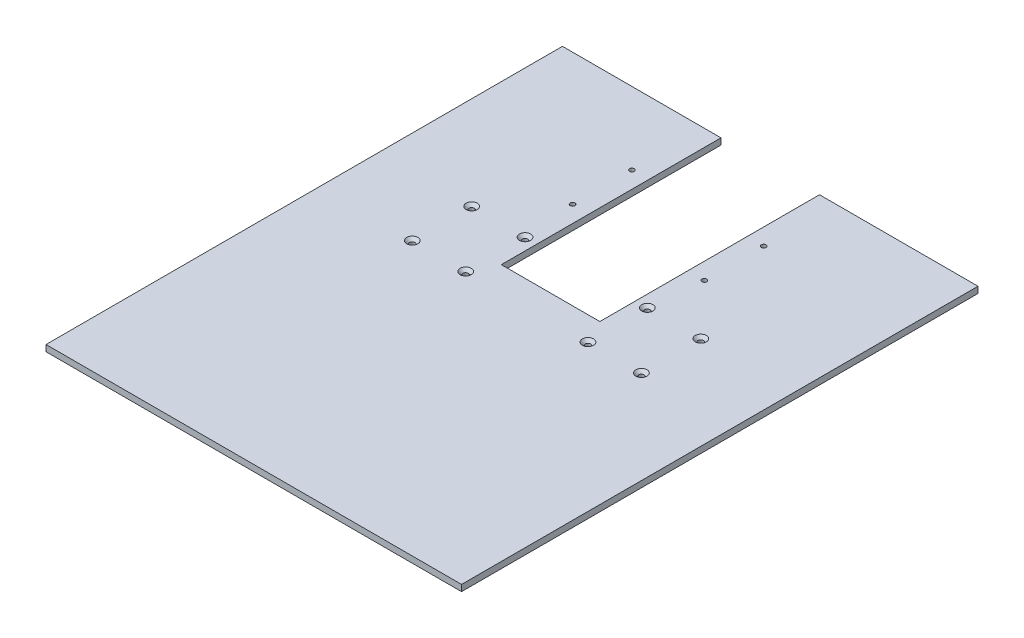
ISO-10303-21;
HEADER;
FILE_DESCRIPTION(('STEP AP214'),'2;1');
FILE_NAME('part.step','',(''),(''),'','','');
FILE_SCHEMA(('AUTOMOTIVE_DESIGN { 1 0 10303 214 1 1 1 1 }'));
ENDSEC;
DATA;
#1=APPLICATION_CONTEXT('core data for automotive mechanical design processes');
#2=APPLICATION_PROTOCOL_DEFINITION('international standard','automotive_design',2000,#1);
#3=PRODUCT_CONTEXT('',#1,'mechanical');
#4=PRODUCT('Part','Part','',(#3));
#5=PRODUCT_RELATED_PRODUCT_CATEGORY('part','',(#4));
#6=PRODUCT_DEFINITION_FORMATION('','',#4);
#7=PRODUCT_DEFINITION_CONTEXT('part definition',#1,'design');
#8=PRODUCT_DEFINITION('design','',#6,#7);
#9=PRODUCT_DEFINITION_SHAPE('','',#8);
#10=(LENGTH_UNIT() NAMED_UNIT(*) SI_UNIT(.MILLI.,.METRE.));
#11=(NAMED_UNIT(*) PLANE_ANGLE_UNIT() SI_UNIT($,.RADIAN.));
#12=(NAMED_UNIT(*) SI_UNIT($,.STERADIAN.) SOLID_ANGLE_UNIT());
#13=UNCERTAINTY_MEASURE_WITH_UNIT(LENGTH_MEASURE(1.E-05),#10,'distance_accuracy_value','');
#14=(GEOMETRIC_REPRESENTATION_CONTEXT(3) GLOBAL_UNCERTAINTY_ASSIGNED_CONTEXT((#13)) GLOBAL_UNIT_ASSIGNED_CONTEXT((#10,
#11,#12)) REPRESENTATION_CONTEXT('',''));
#15=CARTESIAN_POINT('',(0.,0.,0.));
#16=DIRECTION('',(0.,0.,1.));
#17=DIRECTION('',(1.,0.,0.));
#18=AXIS2_PLACEMENT_3D('',#15,#16,#17);
#19=CARTESIAN_POINT('',(0.,5.3,0.));
#20=DIRECTION('',(0.,-1.,0.));
#21=DIRECTION('',(0.,0.,-1.));
#22=AXIS2_PLACEMENT_3D('',#19,#20,#21);
#23=PLANE('',#22);
#24=CARTESIAN_POINT('',(-181.830578512397,5.3,47.4793388429752));
#25=DIRECTION('',(0.,1.,0.));
#26=DIRECTION('',(0.,0.,1.));
#27=AXIS2_PLACEMENT_3D('',#24,#25,#26);
#28=CIRCLE('',#27,4.70000000000001);
#29=CARTESIAN_POINT('',(-181.830578512397,5.3,52.1793388429752));
#30=VERTEX_POINT('',#29);
#31=EDGE_CURVE('E542',#30,#30,#28,.T.);
#32=ORIENTED_EDGE('',*,*,#31,.F.);
#33=EDGE_LOOP('',(#32));
#34=FACE_BOUND('',#33,.T.);
#35=DIRECTION('',(0.,0.,1.));
#36=VECTOR('',#35,1.);
#37=CARTESIAN_POINT('',(-260.330578512397,5.3,327.479338842975));
#38=LINE('',#37,#36);
#39=CARTESIAN_POINT('',(-260.330578512397,5.3,-107.520661157025));
#40=VERTEX_POINT('',#39);
#41=CARTESIAN_POINT('',(-260.330578512397,5.3,327.479338842975));
#42=VERTEX_POINT('',#41);
#43=EDGE_CURVE('E109',#40,#42,#38,.T.);
#44=ORIENTED_EDGE('',*,*,#43,.T.);
#45=DIRECTION('',(1.,0.,0.));
#46=VECTOR('',#45,1.);
#47=CARTESIAN_POINT('',(-260.330578512397,5.3,327.479338842975));
#48=LINE('',#47,#46);
#49=CARTESIAN_POINT('',(89.6694214876034,5.3,327.479338842975));
#50=VERTEX_POINT('',#49);
#51=EDGE_CURVE('E156',#42,#50,#48,.T.);
#52=ORIENTED_EDGE('',*,*,#51,.T.);
#53=DIRECTION('',(0.,0.,-1.));
#54=VECTOR('',#53,1.);
#55=CARTESIAN_POINT('',(89.6694214876034,5.3,327.479338842975));
#56=LINE('',#55,#54);
#57=CARTESIAN_POINT('',(89.6694214876034,5.3,-107.520661157025));
#58=VERTEX_POINT('',#57);
#59=EDGE_CURVE('E158',#50,#58,#56,.T.);
#60=ORIENTED_EDGE('',*,*,#59,.T.);
#61=DIRECTION('',(1.,0.,0.));
#62=VECTOR('',#61,1.);
#63=CARTESIAN_POINT('',(-43.8305785123966,5.30000000000001,-107.520661157025));
#64=LINE('',#63,#62);
#65=CARTESIAN_POINT('',(-43.8305785123966,5.30000000000001,-107.520661157025));
#66=VERTEX_POINT('',#65);
#67=EDGE_CURVE('E133',#66,#58,#64,.T.);
#68=ORIENTED_EDGE('',*,*,#67,.F.);
#69=DIRECTION('',(0.,0.,1.));
#70=VECTOR('',#69,1.);
#71=CARTESIAN_POINT('',(-43.8305785123966,5.30000000000001,-107.520661157025));
#72=LINE('',#71,#70);
#73=CARTESIAN_POINT('',(-43.8305785123966,5.3,77.4793388429752));
#74=VERTEX_POINT('',#73);
#75=EDGE_CURVE('E123',#66,#74,#72,.T.);
#76=ORIENTED_EDGE('',*,*,#75,.T.);
#77=DIRECTION('',(-1.,0.,0.));
#78=VECTOR('',#77,1.);
#79=CARTESIAN_POINT('',(-260.330578512397,5.3,77.4793388429752));
#80=LINE('',#79,#78);
#81=CARTESIAN_POINT('',(-126.830578512397,5.3,77.4793388429752));
#82=VERTEX_POINT('',#81);
#83=EDGE_CURVE('E51',#74,#82,#80,.T.);
#84=ORIENTED_EDGE('',*,*,#83,.T.);
#85=DIRECTION('',(0.,0.,1.));
#86=VECTOR('',#85,1.);
#87=CARTESIAN_POINT('',(-126.830578512397,5.30000000000001,-107.520661157025));
#88=LINE('',#87,#86);
#89=CARTESIAN_POINT('',(-126.830578512397,5.30000000000001,-107.520661157025));
#90=VERTEX_POINT('',#89);
#91=EDGE_CURVE('E148',#90,#82,#88,.T.);
#92=ORIENTED_EDGE('',*,*,#91,.F.);
#93=DIRECTION('',(1.,0.,0.));
#94=VECTOR('',#93,1.);
#95=CARTESIAN_POINT('',(-126.830578512397,5.30000000000001,-107.520661157025));
#96=LINE('',#95,#94);
#97=EDGE_CURVE('E146',#40,#90,#96,.T.);
#98=ORIENTED_EDGE('',*,*,#97,.F.);
#99=EDGE_LOOP('',(#44,#52,#60,#68,#76,#84,#92,#98));
#100=FACE_BOUND('',#99,.T.);
#101=CARTESIAN_POINT('',(-140.830578512397,5.3,3.47933884297523));
#102=DIRECTION('',(0.,1.,0.));
#103=DIRECTION('',(0.,0.,1.));
#104=AXIS2_PLACEMENT_3D('',#101,#102,#103);
#105=CIRCLE('',#104,2.);
#106=CARTESIAN_POINT('',(-140.830578512397,5.3,5.47933884297523));
#107=VERTEX_POINT('',#106);
#108=EDGE_CURVE('E630',#107,#107,#105,.T.);
#109=ORIENTED_EDGE('',*,*,#108,.F.);
#110=EDGE_LOOP('',(#109));
#111=FACE_BOUND('',#110,.T.);
#112=CARTESIAN_POINT('',(-140.830578512397,5.3,-46.5206611570248));
#113=DIRECTION('',(0.,1.,0.));
#114=DIRECTION('',(0.,0.,1.));
#115=AXIS2_PLACEMENT_3D('',#112,#113,#114);
#116=CIRCLE('',#115,2.);
#117=CARTESIAN_POINT('',(-140.830578512397,5.3,-44.5206611570248));
#118=VERTEX_POINT('',#117);
#119=EDGE_CURVE('E624',#118,#118,#116,.T.);
#120=ORIENTED_EDGE('',*,*,#119,.F.);
#121=EDGE_LOOP('',(#120));
#122=FACE_BOUND('',#121,.T.);
#123=CARTESIAN_POINT('',(-29.8305785123966,5.3,-46.5206611570248));
#124=DIRECTION('',(0.,1.,0.));
#125=DIRECTION('',(0.,0.,1.));
#126=AXIS2_PLACEMENT_3D('',#123,#124,#125);
#127=CIRCLE('',#126,2.);
#128=CARTESIAN_POINT('',(-29.8305785123966,5.3,-44.5206611570248));
#129=VERTEX_POINT('',#128);
#130=EDGE_CURVE('E618',#129,#129,#127,.T.);
#131=ORIENTED_EDGE('',*,*,#130,.F.);
#132=EDGE_LOOP('',(#131));
#133=FACE_BOUND('',#132,.T.);
#134=CARTESIAN_POINT('',(-29.8305785123966,5.3,3.47933884297523));
#135=DIRECTION('',(0.,1.,0.));
#136=DIRECTION('',(0.,0.,1.));
#137=AXIS2_PLACEMENT_3D('',#134,#135,#136);
#138=CIRCLE('',#137,2.);
#139=CARTESIAN_POINT('',(-29.8305785123966,5.3,5.47933884297523));
#140=VERTEX_POINT('',#139);
#141=EDGE_CURVE('E612',#140,#140,#138,.T.);
#142=ORIENTED_EDGE('',*,*,#141,.F.);
#143=EDGE_LOOP('',(#142));
#144=FACE_BOUND('',#143,.T.);
#145=CARTESIAN_POINT('',(-33.8305785123966,5.3,97.4793388429752));
#146=DIRECTION('',(0.,1.,0.));
#147=DIRECTION('',(0.,0.,1.));
#148=AXIS2_PLACEMENT_3D('',#145,#146,#147);
#149=CIRCLE('',#148,4.7);
#150=CARTESIAN_POINT('',(-33.8305785123966,5.3,102.179338842975));
#151=VERTEX_POINT('',#150);
#152=EDGE_CURVE('E603',#151,#151,#149,.T.);
#153=ORIENTED_EDGE('',*,*,#152,.F.);
#154=EDGE_LOOP('',(#153));
#155=FACE_BOUND('',#154,.T.);
#156=CARTESIAN_POINT('',(11.1694214876034,5.3,97.4793388429752));
#157=DIRECTION('',(0.,1.,0.));
#158=DIRECTION('',(0.,0.,1.));
#159=AXIS2_PLACEMENT_3D('',#156,#157,#158);
#160=CIRCLE('',#159,4.7);
#161=CARTESIAN_POINT('',(11.1694214876034,5.3,102.179338842975));
#162=VERTEX_POINT('',#161);
#163=EDGE_CURVE('E594',#162,#162,#160,.T.);
#164=ORIENTED_EDGE('',*,*,#163,.F.);
#165=EDGE_LOOP('',(#164));
#166=FACE_BOUND('',#165,.T.);
#167=CARTESIAN_POINT('',(11.1694214876034,5.3,47.4793388429752));
#168=DIRECTION('',(0.,1.,0.));
#169=DIRECTION('',(0.,0.,1.));
#170=AXIS2_PLACEMENT_3D('',#167,#168,#169);
#171=CIRCLE('',#170,4.7);
#172=CARTESIAN_POINT('',(11.1694214876034,5.3,52.1793388429752));
#173=VERTEX_POINT('',#172);
#174=EDGE_CURVE('E585',#173,#173,#171,.T.);
#175=ORIENTED_EDGE('',*,*,#174,.F.);
#176=EDGE_LOOP('',(#175));
#177=FACE_BOUND('',#176,.T.);
#178=CARTESIAN_POINT('',(-33.8305785123966,5.3,47.4793388429752));
#179=DIRECTION('',(0.,1.,0.));
#180=DIRECTION('',(0.,0.,1.));
#181=AXIS2_PLACEMENT_3D('',#178,#179,#180);
#182=CIRCLE('',#181,4.7);
#183=CARTESIAN_POINT('',(-33.8305785123966,5.3,52.1793388429752));
#184=VERTEX_POINT('',#183);
#185=EDGE_CURVE('E576',#184,#184,#182,.T.);
#186=ORIENTED_EDGE('',*,*,#185,.F.);
#187=EDGE_LOOP('',(#186));
#188=FACE_BOUND('',#187,.T.);
#189=CARTESIAN_POINT('',(-136.830578512397,5.3,97.4793388429752));
#190=DIRECTION('',(0.,1.,0.));
#191=DIRECTION('',(0.,0.,1.));
#192=AXIS2_PLACEMENT_3D('',#189,#190,#191);
#193=CIRCLE('',#192,4.70000000000001);
#194=CARTESIAN_POINT('',(-136.830578512397,5.3,102.179338842975));
#195=VERTEX_POINT('',#194);
#196=EDGE_CURVE('E567',#195,#195,#193,.T.);
#197=ORIENTED_EDGE('',*,*,#196,.F.);
#198=EDGE_LOOP('',(#197));
#199=FACE_BOUND('',#198,.T.);
#200=CARTESIAN_POINT('',(-181.830578512397,5.3,97.4793388429752));
#201=DIRECTION('',(0.,1.,0.));
#202=DIRECTION('',(0.,0.,1.));
#203=AXIS2_PLACEMENT_3D('',#200,#201,#202);
#204=CIRCLE('',#203,4.70000000000001);
#205=CARTESIAN_POINT('',(-181.830578512397,5.3,102.179338842975));
#206=VERTEX_POINT('',#205);
#207=EDGE_CURVE('E558',#206,#206,#204,.T.);
#208=ORIENTED_EDGE('',*,*,#207,.F.);
#209=EDGE_LOOP('',(#208));
#210=FACE_BOUND('',#209,.T.);
#211=CARTESIAN_POINT('',(-136.830578512397,5.3,47.4793388429752));
#212=DIRECTION('',(0.,1.,0.));
#213=DIRECTION('',(0.,0.,1.));
#214=AXIS2_PLACEMENT_3D('',#211,#212,#213);
#215=CIRCLE('',#214,4.70000000000001);
#216=CARTESIAN_POINT('',(-136.830578512397,5.3,52.1793388429752));
#217=VERTEX_POINT('',#216);
#218=EDGE_CURVE('E549',#217,#217,#215,.T.);
#219=ORIENTED_EDGE('',*,*,#218,.F.);
#220=EDGE_LOOP('',(#219));
#221=FACE_BOUND('',#220,.T.);
#222=ADVANCED_FACE('F36',(#34,#100,#111,#122,#133,#144,#155,#166,#177,#188,#199,#210,#221),#23,.F.);
#223=CARTESIAN_POINT('',(-260.330578512397,5.3,77.4793388429752));
#224=DIRECTION('',(0.,0.,1.));
#225=DIRECTION('',(1.,0.,0.));
#226=AXIS2_PLACEMENT_3D('',#223,#224,#225);
#227=PLANE('',#226);
#228=DIRECTION('',(0.,1.,0.));
#229=VECTOR('',#228,1.);
#230=CARTESIAN_POINT('',(-43.8305785123966,5.30000000000001,77.4793388429752));
#231=LINE('',#230,#229);
#232=CARTESIAN_POINT('',(-43.8305785123966,0.,77.4793388429752));
#233=VERTEX_POINT('',#232);
#234=EDGE_CURVE('E113',#233,#74,#231,.T.);
#235=ORIENTED_EDGE('',*,*,#234,.F.);
#236=DIRECTION('',(-1.,0.,0.));
#237=VECTOR('',#236,1.);
#238=CARTESIAN_POINT('',(-260.330578512397,0.,77.4793388429752));
#239=LINE('',#238,#237);
#240=CARTESIAN_POINT('',(-126.830578512397,0.,77.4793388429752));
#241=VERTEX_POINT('',#240);
#242=EDGE_CURVE('E100',#233,#241,#239,.T.);
#243=ORIENTED_EDGE('',*,*,#242,.T.);
#244=DIRECTION('',(0.,-1.,0.));
#245=VECTOR('',#244,1.);
#246=CARTESIAN_POINT('',(-126.830578512397,5.30000000000001,77.4793388429752));
#247=LINE('',#246,#245);
#248=EDGE_CURVE('E117',#82,#241,#247,.T.);
#249=ORIENTED_EDGE('',*,*,#248,.F.);
#250=ORIENTED_EDGE('',*,*,#83,.F.);
#251=EDGE_LOOP('',(#235,#243,#249,#250));
#252=FACE_BOUND('',#251,.T.);
#253=ADVANCED_FACE('F114',(#252),#227,.F.);
#254=CARTESIAN_POINT('',(-260.330578512397,5.3,327.479338842975));
#255=DIRECTION('',(1.,0.,0.));
#256=DIRECTION('',(0.,0.,-1.));
#257=AXIS2_PLACEMENT_3D('',#254,#255,#256);
#258=PLANE('',#257);
#259=DIRECTION('',(0.,0.,1.));
#260=VECTOR('',#259,1.);
#261=CARTESIAN_POINT('',(-260.330578512397,0.,327.479338842975));
#262=LINE('',#261,#260);
#263=CARTESIAN_POINT('',(-260.330578512397,0.,-107.520661157025));
#264=VERTEX_POINT('',#263);
#265=CARTESIAN_POINT('',(-260.330578512397,0.,327.479338842975));
#266=VERTEX_POINT('',#265);
#267=EDGE_CURVE('E153',#264,#266,#262,.T.);
#268=ORIENTED_EDGE('',*,*,#267,.T.);
#269=DIRECTION('',(0.,-1.,0.));
#270=VECTOR('',#269,1.);
#271=CARTESIAN_POINT('',(-260.330578512397,5.3,327.479338842975));
#272=LINE('',#271,#270);
#273=EDGE_CURVE('E11',#42,#266,#272,.T.);
#274=ORIENTED_EDGE('',*,*,#273,.F.);
#275=ORIENTED_EDGE('',*,*,#43,.F.);
#276=DIRECTION('',(0.,1.,0.));
#277=VECTOR('',#276,1.);
#278=CARTESIAN_POINT('',(-260.330578512397,5.3,-107.520661157025));
#279=LINE('',#278,#277);
#280=EDGE_CURVE('E143',#264,#40,#279,.T.);
#281=ORIENTED_EDGE('',*,*,#280,.F.);
#282=EDGE_LOOP('',(#268,#274,#275,#281));
#283=FACE_BOUND('',#282,.T.);
#284=ADVANCED_FACE('F38',(#283),#258,.F.);
#285=CARTESIAN_POINT('',(-260.330578512397,5.3,327.479338842975));
#286=DIRECTION('',(0.,0.,-1.));
#287=DIRECTION('',(-1.,0.,0.));
#288=AXIS2_PLACEMENT_3D('',#285,#286,#287);
#289=PLANE('',#288);
#290=DIRECTION('',(1.,0.,0.));
#291=VECTOR('',#290,1.);
#292=CARTESIAN_POINT('',(-260.330578512397,0.,327.479338842975));
#293=LINE('',#292,#291);
#294=CARTESIAN_POINT('',(89.6694214876034,0.,327.479338842975));
#295=VERTEX_POINT('',#294);
#296=EDGE_CURVE('E163',#266,#295,#293,.T.);
#297=ORIENTED_EDGE('',*,*,#296,.T.);
#298=DIRECTION('',(0.,-1.,0.));
#299=VECTOR('',#298,1.);
#300=CARTESIAN_POINT('',(89.6694214876034,5.3,327.479338842975));
#301=LINE('',#300,#299);
#302=EDGE_CURVE('E44',#50,#295,#301,.T.);
#303=ORIENTED_EDGE('',*,*,#302,.F.);
#304=ORIENTED_EDGE('',*,*,#51,.F.);
#305=ORIENTED_EDGE('',*,*,#273,.T.);
#306=EDGE_LOOP('',(#297,#303,#304,#305));
#307=FACE_BOUND('',#306,.T.);
#308=ADVANCED_FACE('F178',(#307),#289,.F.);
#309=CARTESIAN_POINT('',(89.6694214876034,5.3,327.479338842975));
#310=DIRECTION('',(-1.,0.,0.));
#311=DIRECTION('',(0.,0.,1.));
#312=AXIS2_PLACEMENT_3D('',#309,#310,#311);
#313=PLANE('',#312);
#314=DIRECTION('',(0.,0.,-1.));
#315=VECTOR('',#314,1.);
#316=CARTESIAN_POINT('',(89.6694214876034,0.,327.479338842975));
#317=LINE('',#316,#315);
#318=CARTESIAN_POINT('',(89.6694214876034,0.,-107.520661157025));
#319=VERTEX_POINT('',#318);
#320=EDGE_CURVE('E110',#295,#319,#317,.T.);
#321=ORIENTED_EDGE('',*,*,#320,.T.);
#322=DIRECTION('',(0.,-1.,0.));
#323=VECTOR('',#322,1.);
#324=CARTESIAN_POINT('',(89.6694214876034,5.3,-107.520661157025));
#325=LINE('',#324,#323);
#326=EDGE_CURVE('E125',#58,#319,#325,.T.);
#327=ORIENTED_EDGE('',*,*,#326,.F.);
#328=ORIENTED_EDGE('',*,*,#59,.F.);
#329=ORIENTED_EDGE('',*,*,#302,.T.);
#330=EDGE_LOOP('',(#321,#327,#328,#329));
#331=FACE_BOUND('',#330,.T.);
#332=ADVANCED_FACE('F170',(#331),#313,.F.);
#333=CARTESIAN_POINT('',(0.,0.,0.));
#334=DIRECTION('',(0.,-1.,0.));
#335=DIRECTION('',(0.,0.,-1.));
#336=AXIS2_PLACEMENT_3D('',#333,#334,#335);
#337=PLANE('',#336);
#338=CARTESIAN_POINT('',(-181.830578512397,0.,47.4793388429752));
#339=DIRECTION('',(0.,1.,0.));
#340=DIRECTION('',(0.,0.,1.));
#341=AXIS2_PLACEMENT_3D('',#338,#339,#340);
#342=CIRCLE('',#341,2.25);
#343=CARTESIAN_POINT('',(-181.830578512397,0.,49.7293388429752));
#344=VERTEX_POINT('',#343);
#345=EDGE_CURVE('E544',#344,#344,#342,.T.);
#346=ORIENTED_EDGE('',*,*,#345,.T.);
#347=EDGE_LOOP('',(#346));
#348=FACE_BOUND('',#347,.T.);
#349=CARTESIAN_POINT('',(-136.830578512397,0.,47.4793388429752));
#350=DIRECTION('',(0.,1.,0.));
#351=DIRECTION('',(0.,0.,1.));
#352=AXIS2_PLACEMENT_3D('',#349,#350,#351);
#353=CIRCLE('',#352,2.25);
#354=CARTESIAN_POINT('',(-136.830578512397,0.,49.7293388429752));
#355=VERTEX_POINT('',#354);
#356=EDGE_CURVE('E555',#355,#355,#353,.T.);
#357=ORIENTED_EDGE('',*,*,#356,.T.);
#358=EDGE_LOOP('',(#357));
#359=FACE_BOUND('',#358,.T.);
#360=CARTESIAN_POINT('',(-181.830578512397,0.,97.4793388429752));
#361=DIRECTION('',(0.,1.,0.));
#362=DIRECTION('',(0.,0.,1.));
#363=AXIS2_PLACEMENT_3D('',#360,#361,#362);
#364=CIRCLE('',#363,2.25);
#365=CARTESIAN_POINT('',(-181.830578512397,0.,99.7293388429753));
#366=VERTEX_POINT('',#365);
#367=EDGE_CURVE('E564',#366,#366,#364,.T.);
#368=ORIENTED_EDGE('',*,*,#367,.T.);
#369=EDGE_LOOP('',(#368));
#370=FACE_BOUND('',#369,.T.);
#371=CARTESIAN_POINT('',(-136.830578512397,0.,97.4793388429752));
#372=DIRECTION('',(0.,1.,0.));
#373=DIRECTION('',(0.,0.,1.));
#374=AXIS2_PLACEMENT_3D('',#371,#372,#373);
#375=CIRCLE('',#374,2.25);
#376=CARTESIAN_POINT('',(-136.830578512397,0.,99.7293388429753));
#377=VERTEX_POINT('',#376);
#378=EDGE_CURVE('E573',#377,#377,#375,.T.);
#379=ORIENTED_EDGE('',*,*,#378,.T.);
#380=EDGE_LOOP('',(#379));
#381=FACE_BOUND('',#380,.T.);
#382=CARTESIAN_POINT('',(-33.8305785123966,0.,47.4793388429752));
#383=DIRECTION('',(0.,1.,0.));
#384=DIRECTION('',(0.,0.,1.));
#385=AXIS2_PLACEMENT_3D('',#382,#383,#384);
#386=CIRCLE('',#385,2.25);
#387=CARTESIAN_POINT('',(-33.8305785123966,0.,49.7293388429752));
#388=VERTEX_POINT('',#387);
#389=EDGE_CURVE('E582',#388,#388,#386,.T.);
#390=ORIENTED_EDGE('',*,*,#389,.T.);
#391=EDGE_LOOP('',(#390));
#392=FACE_BOUND('',#391,.T.);
#393=CARTESIAN_POINT('',(11.1694214876034,0.,47.4793388429752));
#394=DIRECTION('',(0.,1.,0.));
#395=DIRECTION('',(0.,0.,1.));
#396=AXIS2_PLACEMENT_3D('',#393,#394,#395);
#397=CIRCLE('',#396,2.25);
#398=CARTESIAN_POINT('',(11.1694214876034,0.,49.7293388429752));
#399=VERTEX_POINT('',#398);
#400=EDGE_CURVE('E591',#399,#399,#397,.T.);
#401=ORIENTED_EDGE('',*,*,#400,.T.);
#402=EDGE_LOOP('',(#401));
#403=FACE_BOUND('',#402,.T.);
#404=CARTESIAN_POINT('',(11.1694214876034,0.,97.4793388429752));
#405=DIRECTION('',(0.,1.,0.));
#406=DIRECTION('',(0.,0.,1.));
#407=AXIS2_PLACEMENT_3D('',#404,#405,#406);
#408=CIRCLE('',#407,2.25);
#409=CARTESIAN_POINT('',(11.1694214876034,0.,99.7293388429752));
#410=VERTEX_POINT('',#409);
#411=EDGE_CURVE('E600',#410,#410,#408,.T.);
#412=ORIENTED_EDGE('',*,*,#411,.T.);
#413=EDGE_LOOP('',(#412));
#414=FACE_BOUND('',#413,.T.);
#415=CARTESIAN_POINT('',(-33.8305785123966,0.,97.4793388429752));
#416=DIRECTION('',(0.,1.,0.));
#417=DIRECTION('',(0.,0.,1.));
#418=AXIS2_PLACEMENT_3D('',#415,#416,#417);
#419=CIRCLE('',#418,2.25);
#420=CARTESIAN_POINT('',(-33.8305785123966,0.,99.7293388429752));
#421=VERTEX_POINT('',#420);
#422=EDGE_CURVE('E609',#421,#421,#419,.T.);
#423=ORIENTED_EDGE('',*,*,#422,.T.);
#424=EDGE_LOOP('',(#423));
#425=FACE_BOUND('',#424,.T.);
#426=CARTESIAN_POINT('',(-29.8305785123966,0.,3.47933884297523));
#427=DIRECTION('',(0.,1.,0.));
#428=DIRECTION('',(0.,0.,1.));
#429=AXIS2_PLACEMENT_3D('',#426,#427,#428);
#430=CIRCLE('',#429,2.);
#431=CARTESIAN_POINT('',(-29.8305785123966,0.,5.47933884297523));
#432=VERTEX_POINT('',#431);
#433=EDGE_CURVE('E615',#432,#432,#430,.T.);
#434=ORIENTED_EDGE('',*,*,#433,.T.);
#435=EDGE_LOOP('',(#434));
#436=FACE_BOUND('',#435,.T.);
#437=CARTESIAN_POINT('',(-29.8305785123966,0.,-46.5206611570248));
#438=DIRECTION('',(0.,1.,0.));
#439=DIRECTION('',(0.,0.,1.));
#440=AXIS2_PLACEMENT_3D('',#437,#438,#439);
#441=CIRCLE('',#440,2.);
#442=CARTESIAN_POINT('',(-29.8305785123966,0.,-44.5206611570248));
#443=VERTEX_POINT('',#442);
#444=EDGE_CURVE('E621',#443,#443,#441,.T.);
#445=ORIENTED_EDGE('',*,*,#444,.T.);
#446=EDGE_LOOP('',(#445));
#447=FACE_BOUND('',#446,.T.);
#448=CARTESIAN_POINT('',(-140.830578512397,0.,-46.5206611570248));
#449=DIRECTION('',(0.,1.,0.));
#450=DIRECTION('',(0.,0.,1.));
#451=AXIS2_PLACEMENT_3D('',#448,#449,#450);
#452=CIRCLE('',#451,2.);
#453=CARTESIAN_POINT('',(-140.830578512397,0.,-44.5206611570248));
#454=VERTEX_POINT('',#453);
#455=EDGE_CURVE('E627',#454,#454,#452,.T.);
#456=ORIENTED_EDGE('',*,*,#455,.T.);
#457=EDGE_LOOP('',(#456));
#458=FACE_BOUND('',#457,.T.);
#459=CARTESIAN_POINT('',(-140.830578512397,0.,3.47933884297523));
#460=DIRECTION('',(0.,1.,0.));
#461=DIRECTION('',(0.,0.,1.));
#462=AXIS2_PLACEMENT_3D('',#459,#460,#461);
#463=CIRCLE('',#462,2.);
#464=CARTESIAN_POINT('',(-140.830578512397,0.,5.47933884297523));
#465=VERTEX_POINT('',#464);
#466=EDGE_CURVE('E127',#465,#465,#463,.T.);
#467=ORIENTED_EDGE('',*,*,#466,.T.);
#468=EDGE_LOOP('',(#467));
#469=FACE_BOUND('',#468,.T.);
#470=ORIENTED_EDGE('',*,*,#267,.F.);
#471=DIRECTION('',(-1.,0.,0.));
#472=VECTOR('',#471,1.);
#473=CARTESIAN_POINT('',(-126.830578512397,0.,-107.520661157025));
#474=LINE('',#473,#472);
#475=CARTESIAN_POINT('',(-126.830578512397,0.,-107.520661157025));
#476=VERTEX_POINT('',#475);
#477=EDGE_CURVE('E140',#476,#264,#474,.T.);
#478=ORIENTED_EDGE('',*,*,#477,.F.);
#479=DIRECTION('',(0.,0.,1.));
#480=VECTOR('',#479,1.);
#481=CARTESIAN_POINT('',(-126.830578512397,0.,-107.520661157025));
#482=LINE('',#481,#480);
#483=EDGE_CURVE('E107',#476,#241,#482,.T.);
#484=ORIENTED_EDGE('',*,*,#483,.T.);
#485=ORIENTED_EDGE('',*,*,#242,.F.);
#486=DIRECTION('',(0.,0.,1.));
#487=VECTOR('',#486,1.);
#488=CARTESIAN_POINT('',(-43.8305785123966,0.,-107.520661157025));
#489=LINE('',#488,#487);
#490=CARTESIAN_POINT('',(-43.8305785123966,0.,-107.520661157025));
#491=VERTEX_POINT('',#490);
#492=EDGE_CURVE('E104',#491,#233,#489,.T.);
#493=ORIENTED_EDGE('',*,*,#492,.F.);
#494=DIRECTION('',(-1.,0.,0.));
#495=VECTOR('',#494,1.);
#496=CARTESIAN_POINT('',(-43.8305785123966,0.,-107.520661157025));
#497=LINE('',#496,#495);
#498=EDGE_CURVE('E122',#319,#491,#497,.T.);
#499=ORIENTED_EDGE('',*,*,#498,.F.);
#500=ORIENTED_EDGE('',*,*,#320,.F.);
#501=ORIENTED_EDGE('',*,*,#296,.F.);
#502=EDGE_LOOP('',(#470,#478,#484,#485,#493,#499,#500,#501));
#503=FACE_BOUND('',#502,.T.);
#504=ADVANCED_FACE('F101',(#348,#359,#370,#381,#392,#403,#414,#425,#436,#447,#458,#469,#503),
#337,.T.);
#505=CARTESIAN_POINT('',(-126.830578512397,5.30000000000001,-107.520661157025));
#506=DIRECTION('',(-1.,0.,0.));
#507=DIRECTION('',(0.,0.,1.));
#508=AXIS2_PLACEMENT_3D('',#505,#506,#507);
#509=PLANE('',#508);
#510=ORIENTED_EDGE('',*,*,#248,.T.);
#511=ORIENTED_EDGE('',*,*,#483,.F.);
#512=DIRECTION('',(0.,-1.,0.));
#513=VECTOR('',#512,1.);
#514=CARTESIAN_POINT('',(-126.830578512397,5.30000000000001,-107.520661157025));
#515=LINE('',#514,#513);
#516=EDGE_CURVE('E137',#90,#476,#515,.T.);
#517=ORIENTED_EDGE('',*,*,#516,.F.);
#518=ORIENTED_EDGE('',*,*,#91,.T.);
#519=EDGE_LOOP('',(#510,#511,#517,#518));
#520=FACE_BOUND('',#519,.T.);
#521=ADVANCED_FACE('F185',(#520),#509,.F.);
#522=CARTESIAN_POINT('',(0.,0.,-107.520661157025));
#523=DIRECTION('',(0.,0.,-1.));
#524=DIRECTION('',(-1.,0.,0.));
#525=AXIS2_PLACEMENT_3D('',#522,#523,#524);
#526=PLANE('',#525);
#527=ORIENTED_EDGE('',*,*,#516,.T.);
#528=ORIENTED_EDGE('',*,*,#477,.T.);
#529=ORIENTED_EDGE('',*,*,#280,.T.);
#530=ORIENTED_EDGE('',*,*,#97,.T.);
#531=EDGE_LOOP('',(#527,#528,#529,#530));
#532=FACE_BOUND('',#531,.T.);
#533=ADVANCED_FACE('F182',(#532),#526,.T.);
#534=CARTESIAN_POINT('',(-43.8305785123966,5.30000000000001,-107.520661157025));
#535=DIRECTION('',(1.,0.,0.));
#536=DIRECTION('',(0.,0.,-1.));
#537=AXIS2_PLACEMENT_3D('',#534,#535,#536);
#538=PLANE('',#537);
#539=ORIENTED_EDGE('',*,*,#234,.T.);
#540=ORIENTED_EDGE('',*,*,#75,.F.);
#541=DIRECTION('',(0.,1.,0.));
#542=VECTOR('',#541,1.);
#543=CARTESIAN_POINT('',(-43.8305785123966,5.30000000000001,-107.520661157025));
#544=LINE('',#543,#542);
#545=EDGE_CURVE('E118',#491,#66,#544,.T.);
#546=ORIENTED_EDGE('',*,*,#545,.F.);
#547=ORIENTED_EDGE('',*,*,#492,.T.);
#548=EDGE_LOOP('',(#539,#540,#546,#547));
#549=FACE_BOUND('',#548,.T.);
#550=ADVANCED_FACE('F120',(#549),#538,.F.);
#551=CARTESIAN_POINT('',(0.,0.,-107.520661157025));
#552=DIRECTION('',(0.,0.,1.));
#553=DIRECTION('',(1.,0.,0.));
#554=AXIS2_PLACEMENT_3D('',#551,#552,#553);
#555=PLANE('',#554);
#556=ORIENTED_EDGE('',*,*,#545,.T.);
#557=ORIENTED_EDGE('',*,*,#67,.T.);
#558=ORIENTED_EDGE('',*,*,#326,.T.);
#559=ORIENTED_EDGE('',*,*,#498,.T.);
#560=EDGE_LOOP('',(#556,#557,#558,#559));
#561=FACE_BOUND('',#560,.T.);
#562=ADVANCED_FACE('F174',(#561),#555,.F.);
#563=CARTESIAN_POINT('',(-140.830578512397,5.3,3.47933884297523));
#564=DIRECTION('',(0.,1.,0.));
#565=DIRECTION('',(0.,0.,1.));
#566=AXIS2_PLACEMENT_3D('',#563,#564,#565);
#567=CYLINDRICAL_SURFACE('',#566,2.);
#568=ORIENTED_EDGE('',*,*,#466,.F.);
#569=EDGE_LOOP('',(#568));
#570=FACE_BOUND('',#569,.T.);
#571=ORIENTED_EDGE('',*,*,#108,.T.);
#572=EDGE_LOOP('',(#571));
#573=FACE_BOUND('',#572,.T.);
#574=ADVANCED_FACE('F282',(#570,#573),#567,.F.);
#575=CARTESIAN_POINT('',(-140.830578512397,5.3,-46.5206611570248));
#576=DIRECTION('',(0.,1.,0.));
#577=DIRECTION('',(0.,0.,1.));
#578=AXIS2_PLACEMENT_3D('',#575,#576,#577);
#579=CYLINDRICAL_SURFACE('',#578,2.);
#580=ORIENTED_EDGE('',*,*,#455,.F.);
#581=EDGE_LOOP('',(#580));
#582=FACE_BOUND('',#581,.T.);
#583=ORIENTED_EDGE('',*,*,#119,.T.);
#584=EDGE_LOOP('',(#583));
#585=FACE_BOUND('',#584,.T.);
#586=ADVANCED_FACE('F292',(#582,#585),#579,.F.);
#587=CARTESIAN_POINT('',(-29.8305785123966,5.3,-46.5206611570248));
#588=DIRECTION('',(0.,1.,0.));
#589=DIRECTION('',(0.,0.,1.));
#590=AXIS2_PLACEMENT_3D('',#587,#588,#589);
#591=CYLINDRICAL_SURFACE('',#590,2.);
#592=ORIENTED_EDGE('',*,*,#444,.F.);
#593=EDGE_LOOP('',(#592));
#594=FACE_BOUND('',#593,.T.);
#595=ORIENTED_EDGE('',*,*,#130,.T.);
#596=EDGE_LOOP('',(#595));
#597=FACE_BOUND('',#596,.T.);
#598=ADVANCED_FACE('F303',(#594,#597),#591,.F.);
#599=CARTESIAN_POINT('',(-29.8305785123966,5.3,3.47933884297523));
#600=DIRECTION('',(0.,1.,0.));
#601=DIRECTION('',(0.,0.,1.));
#602=AXIS2_PLACEMENT_3D('',#599,#600,#601);
#603=CYLINDRICAL_SURFACE('',#602,2.);
#604=ORIENTED_EDGE('',*,*,#433,.F.);
#605=EDGE_LOOP('',(#604));
#606=FACE_BOUND('',#605,.T.);
#607=ORIENTED_EDGE('',*,*,#141,.T.);
#608=EDGE_LOOP('',(#607));
#609=FACE_BOUND('',#608,.T.);
#610=ADVANCED_FACE('F314',(#606,#609),#603,.F.);
#611=CARTESIAN_POINT('',(-33.8305785123966,5.3,97.4793388429752));
#612=DIRECTION('',(0.,1.,0.));
#613=DIRECTION('',(0.,0.,1.));
#614=AXIS2_PLACEMENT_3D('',#611,#612,#613);
#615=CYLINDRICAL_SURFACE('',#614,2.25);
#616=ORIENTED_EDGE('',*,*,#422,.F.);
#617=EDGE_LOOP('',(#616));
#618=FACE_BOUND('',#617,.T.);
#619=CARTESIAN_POINT('',(-33.8305785123966,2.85,97.4793388429752));
#620=DIRECTION('',(0.,1.,0.));
#621=DIRECTION('',(0.,0.,1.));
#622=AXIS2_PLACEMENT_3D('',#619,#620,#621);
#623=CIRCLE('',#622,2.25);
#624=CARTESIAN_POINT('',(-33.8305785123966,2.85,99.7293388429752));
#625=VERTEX_POINT('',#624);
#626=EDGE_CURVE('E606',#625,#625,#623,.T.);
#627=ORIENTED_EDGE('',*,*,#626,.T.);
#628=EDGE_LOOP('',(#627));
#629=FACE_BOUND('',#628,.T.);
#630=ADVANCED_FACE('F325',(#618,#629),#615,.F.);
#631=CARTESIAN_POINT('',(-33.8305785123966,5.3,97.4793388429752));
#632=DIRECTION('',(0.,1.,0.));
#633=DIRECTION('',(0.,0.,1.));
#634=AXIS2_PLACEMENT_3D('',#631,#632,#633);
#635=CONICAL_SURFACE('',#634,4.7,0.785398163397448);
#636=ORIENTED_EDGE('',*,*,#626,.F.);
#637=EDGE_LOOP('',(#636));
#638=FACE_BOUND('',#637,.T.);
#639=ORIENTED_EDGE('',*,*,#152,.T.);
#640=EDGE_LOOP('',(#639));
#641=FACE_BOUND('',#640,.T.);
#642=ADVANCED_FACE('F346',(#638,#641),#635,.F.);
#643=CARTESIAN_POINT('',(11.1694214876034,5.3,97.4793388429752));
#644=DIRECTION('',(0.,1.,0.));
#645=DIRECTION('',(0.,0.,1.));
#646=AXIS2_PLACEMENT_3D('',#643,#644,#645);
#647=CYLINDRICAL_SURFACE('',#646,2.25);
#648=ORIENTED_EDGE('',*,*,#411,.F.);
#649=EDGE_LOOP('',(#648));
#650=FACE_BOUND('',#649,.T.);
#651=CARTESIAN_POINT('',(11.1694214876034,2.85,97.4793388429752));
#652=DIRECTION('',(0.,1.,0.));
#653=DIRECTION('',(0.,0.,1.));
#654=AXIS2_PLACEMENT_3D('',#651,#652,#653);
#655=CIRCLE('',#654,2.25);
#656=CARTESIAN_POINT('',(11.1694214876034,2.85,99.7293388429752));
#657=VERTEX_POINT('',#656);
#658=EDGE_CURVE('E597',#657,#657,#655,.T.);
#659=ORIENTED_EDGE('',*,*,#658,.T.);
#660=EDGE_LOOP('',(#659));
#661=FACE_BOUND('',#660,.T.);
#662=ADVANCED_FACE('F357',(#650,#661),#647,.F.);
#663=CARTESIAN_POINT('',(11.1694214876034,5.3,97.4793388429752));
#664=DIRECTION('',(0.,1.,0.));
#665=DIRECTION('',(0.,0.,1.));
#666=AXIS2_PLACEMENT_3D('',#663,#664,#665);
#667=CONICAL_SURFACE('',#666,4.7,0.785398163397448);
#668=ORIENTED_EDGE('',*,*,#658,.F.);
#669=EDGE_LOOP('',(#668));
#670=FACE_BOUND('',#669,.T.);
#671=ORIENTED_EDGE('',*,*,#163,.T.);
#672=EDGE_LOOP('',(#671));
#673=FACE_BOUND('',#672,.T.);
#674=ADVANCED_FACE('F368',(#670,#673),#667,.F.);
#675=CARTESIAN_POINT('',(11.1694214876034,5.3,47.4793388429752));
#676=DIRECTION('',(0.,1.,0.));
#677=DIRECTION('',(0.,0.,1.));
#678=AXIS2_PLACEMENT_3D('',#675,#676,#677);
#679=CYLINDRICAL_SURFACE('',#678,2.25);
#680=ORIENTED_EDGE('',*,*,#400,.F.);
#681=EDGE_LOOP('',(#680));
#682=FACE_BOUND('',#681,.T.);
#683=CARTESIAN_POINT('',(11.1694214876034,2.85,47.4793388429752));
#684=DIRECTION('',(0.,1.,0.));
#685=DIRECTION('',(0.,0.,1.));
#686=AXIS2_PLACEMENT_3D('',#683,#684,#685);
#687=CIRCLE('',#686,2.25);
#688=CARTESIAN_POINT('',(11.1694214876034,2.85,49.7293388429752));
#689=VERTEX_POINT('',#688);
#690=EDGE_CURVE('E588',#689,#689,#687,.T.);
#691=ORIENTED_EDGE('',*,*,#690,.T.);
#692=EDGE_LOOP('',(#691));
#693=FACE_BOUND('',#692,.T.);
#694=ADVANCED_FACE('F379',(#682,#693),#679,.F.);
#695=CARTESIAN_POINT('',(11.1694214876034,5.3,47.4793388429752));
#696=DIRECTION('',(0.,1.,0.));
#697=DIRECTION('',(0.,0.,1.));
#698=AXIS2_PLACEMENT_3D('',#695,#696,#697);
#699=CONICAL_SURFACE('',#698,4.7,0.785398163397448);
#700=ORIENTED_EDGE('',*,*,#690,.F.);
#701=EDGE_LOOP('',(#700));
#702=FACE_BOUND('',#701,.T.);
#703=ORIENTED_EDGE('',*,*,#174,.T.);
#704=EDGE_LOOP('',(#703));
#705=FACE_BOUND('',#704,.T.);
#706=ADVANCED_FACE('F390',(#702,#705),#699,.F.);
#707=CARTESIAN_POINT('',(-33.8305785123966,5.3,47.4793388429752));
#708=DIRECTION('',(0.,1.,0.));
#709=DIRECTION('',(0.,0.,1.));
#710=AXIS2_PLACEMENT_3D('',#707,#708,#709);
#711=CYLINDRICAL_SURFACE('',#710,2.25);
#712=ORIENTED_EDGE('',*,*,#389,.F.);
#713=EDGE_LOOP('',(#712));
#714=FACE_BOUND('',#713,.T.);
#715=CARTESIAN_POINT('',(-33.8305785123966,2.85,47.4793388429752));
#716=DIRECTION('',(0.,1.,0.));
#717=DIRECTION('',(0.,0.,1.));
#718=AXIS2_PLACEMENT_3D('',#715,#716,#717);
#719=CIRCLE('',#718,2.25);
#720=CARTESIAN_POINT('',(-33.8305785123966,2.85,49.7293388429752));
#721=VERTEX_POINT('',#720);
#722=EDGE_CURVE('E579',#721,#721,#719,.T.);
#723=ORIENTED_EDGE('',*,*,#722,.T.);
#724=EDGE_LOOP('',(#723));
#725=FACE_BOUND('',#724,.T.);
#726=ADVANCED_FACE('F401',(#714,#725),#711,.F.);
#727=CARTESIAN_POINT('',(-33.8305785123966,5.3,47.4793388429752));
#728=DIRECTION('',(0.,1.,0.));
#729=DIRECTION('',(0.,0.,1.));
#730=AXIS2_PLACEMENT_3D('',#727,#728,#729);
#731=CONICAL_SURFACE('',#730,4.7,0.785398163397448);
#732=ORIENTED_EDGE('',*,*,#722,.F.);
#733=EDGE_LOOP('',(#732));
#734=FACE_BOUND('',#733,.T.);
#735=ORIENTED_EDGE('',*,*,#185,.T.);
#736=EDGE_LOOP('',(#735));
#737=FACE_BOUND('',#736,.T.);
#738=ADVANCED_FACE('F412',(#734,#737),#731,.F.);
#739=CARTESIAN_POINT('',(-136.830578512397,5.3,97.4793388429752));
#740=DIRECTION('',(0.,1.,0.));
#741=DIRECTION('',(0.,0.,1.));
#742=AXIS2_PLACEMENT_3D('',#739,#740,#741);
#743=CYLINDRICAL_SURFACE('',#742,2.25);
#744=ORIENTED_EDGE('',*,*,#378,.F.);
#745=EDGE_LOOP('',(#744));
#746=FACE_BOUND('',#745,.T.);
#747=CARTESIAN_POINT('',(-136.830578512397,2.85,97.4793388429752));
#748=DIRECTION('',(0.,1.,0.));
#749=DIRECTION('',(0.,0.,1.));
#750=AXIS2_PLACEMENT_3D('',#747,#748,#749);
#751=CIRCLE('',#750,2.25);
#752=CARTESIAN_POINT('',(-136.830578512397,2.85,99.7293388429753));
#753=VERTEX_POINT('',#752);
#754=EDGE_CURVE('E570',#753,#753,#751,.T.);
#755=ORIENTED_EDGE('',*,*,#754,.T.);
#756=EDGE_LOOP('',(#755));
#757=FACE_BOUND('',#756,.T.);
#758=ADVANCED_FACE('F423',(#746,#757),#743,.F.);
#759=CARTESIAN_POINT('',(-136.830578512397,5.3,97.4793388429752));
#760=DIRECTION('',(0.,1.,0.));
#761=DIRECTION('',(0.,0.,1.));
#762=AXIS2_PLACEMENT_3D('',#759,#760,#761);
#763=CONICAL_SURFACE('',#762,4.70000000000001,0.78539816339745);
#764=ORIENTED_EDGE('',*,*,#754,.F.);
#765=EDGE_LOOP('',(#764));
#766=FACE_BOUND('',#765,.T.);
#767=ORIENTED_EDGE('',*,*,#196,.T.);
#768=EDGE_LOOP('',(#767));
#769=FACE_BOUND('',#768,.T.);
#770=ADVANCED_FACE('F434',(#766,#769),#763,.F.);
#771=CARTESIAN_POINT('',(-181.830578512397,5.3,97.4793388429752));
#772=DIRECTION('',(0.,1.,0.));
#773=DIRECTION('',(0.,0.,1.));
#774=AXIS2_PLACEMENT_3D('',#771,#772,#773);
#775=CYLINDRICAL_SURFACE('',#774,2.25);
#776=ORIENTED_EDGE('',*,*,#367,.F.);
#777=EDGE_LOOP('',(#776));
#778=FACE_BOUND('',#777,.T.);
#779=CARTESIAN_POINT('',(-181.830578512397,2.85,97.4793388429752));
#780=DIRECTION('',(0.,1.,0.));
#781=DIRECTION('',(0.,0.,1.));
#782=AXIS2_PLACEMENT_3D('',#779,#780,#781);
#783=CIRCLE('',#782,2.25);
#784=CARTESIAN_POINT('',(-181.830578512397,2.85,99.7293388429753));
#785=VERTEX_POINT('',#784);
#786=EDGE_CURVE('E561',#785,#785,#783,.T.);
#787=ORIENTED_EDGE('',*,*,#786,.T.);
#788=EDGE_LOOP('',(#787));
#789=FACE_BOUND('',#788,.T.);
#790=ADVANCED_FACE('F445',(#778,#789),#775,.F.);
#791=CARTESIAN_POINT('',(-181.830578512397,5.3,97.4793388429752));
#792=DIRECTION('',(0.,1.,0.));
#793=DIRECTION('',(0.,0.,1.));
#794=AXIS2_PLACEMENT_3D('',#791,#792,#793);
#795=CONICAL_SURFACE('',#794,4.70000000000001,0.78539816339745);
#796=ORIENTED_EDGE('',*,*,#786,.F.);
#797=EDGE_LOOP('',(#796));
#798=FACE_BOUND('',#797,.T.);
#799=ORIENTED_EDGE('',*,*,#207,.T.);
#800=EDGE_LOOP('',(#799));
#801=FACE_BOUND('',#800,.T.);
#802=ADVANCED_FACE('F456',(#798,#801),#795,.F.);
#803=CARTESIAN_POINT('',(-136.830578512397,5.3,47.4793388429752));
#804=DIRECTION('',(0.,1.,0.));
#805=DIRECTION('',(0.,0.,1.));
#806=AXIS2_PLACEMENT_3D('',#803,#804,#805);
#807=CYLINDRICAL_SURFACE('',#806,2.25);
#808=ORIENTED_EDGE('',*,*,#356,.F.);
#809=EDGE_LOOP('',(#808));
#810=FACE_BOUND('',#809,.T.);
#811=CARTESIAN_POINT('',(-136.830578512397,2.85,47.4793388429752));
#812=DIRECTION('',(0.,1.,0.));
#813=DIRECTION('',(0.,0.,1.));
#814=AXIS2_PLACEMENT_3D('',#811,#812,#813);
#815=CIRCLE('',#814,2.25);
#816=CARTESIAN_POINT('',(-136.830578512397,2.85,49.7293388429752));
#817=VERTEX_POINT('',#816);
#818=EDGE_CURVE('E552',#817,#817,#815,.T.);
#819=ORIENTED_EDGE('',*,*,#818,.T.);
#820=EDGE_LOOP('',(#819));
#821=FACE_BOUND('',#820,.T.);
#822=ADVANCED_FACE('F467',(#810,#821),#807,.F.);
#823=CARTESIAN_POINT('',(-136.830578512397,5.3,47.4793388429752));
#824=DIRECTION('',(0.,1.,0.));
#825=DIRECTION('',(0.,0.,1.));
#826=AXIS2_PLACEMENT_3D('',#823,#824,#825);
#827=CONICAL_SURFACE('',#826,4.70000000000001,0.78539816339745);
#828=ORIENTED_EDGE('',*,*,#818,.F.);
#829=EDGE_LOOP('',(#828));
#830=FACE_BOUND('',#829,.T.);
#831=ORIENTED_EDGE('',*,*,#218,.T.);
#832=EDGE_LOOP('',(#831));
#833=FACE_BOUND('',#832,.T.);
#834=ADVANCED_FACE('F478',(#830,#833),#827,.F.);
#835=CARTESIAN_POINT('',(-181.830578512397,5.3,47.4793388429752));
#836=DIRECTION('',(0.,1.,0.));
#837=DIRECTION('',(0.,0.,1.));
#838=AXIS2_PLACEMENT_3D('',#835,#836,#837);
#839=CYLINDRICAL_SURFACE('',#838,2.25);
#840=ORIENTED_EDGE('',*,*,#345,.F.);
#841=EDGE_LOOP('',(#840));
#842=FACE_BOUND('',#841,.T.);
#843=CARTESIAN_POINT('',(-181.830578512397,2.85,47.4793388429752));
#844=DIRECTION('',(0.,1.,0.));
#845=DIRECTION('',(0.,0.,1.));
#846=AXIS2_PLACEMENT_3D('',#843,#844,#845);
#847=CIRCLE('',#846,2.25);
#848=CARTESIAN_POINT('',(-181.830578512397,2.85,49.7293388429752));
#849=VERTEX_POINT('',#848);
#850=EDGE_CURVE('E540',#849,#849,#847,.T.);
#851=ORIENTED_EDGE('',*,*,#850,.T.);
#852=EDGE_LOOP('',(#851));
#853=FACE_BOUND('',#852,.T.);
#854=ADVANCED_FACE('F489',(#842,#853),#839,.F.);
#855=CARTESIAN_POINT('',(-181.830578512397,5.3,47.4793388429752));
#856=DIRECTION('',(0.,1.,0.));
#857=DIRECTION('',(0.,0.,1.));
#858=AXIS2_PLACEMENT_3D('',#855,#856,#857);
#859=CONICAL_SURFACE('',#858,4.70000000000001,0.78539816339745);
#860=ORIENTED_EDGE('',*,*,#850,.F.);
#861=EDGE_LOOP('',(#860));
#862=FACE_BOUND('',#861,.T.);
#863=ORIENTED_EDGE('',*,*,#31,.T.);
#864=EDGE_LOOP('',(#863));
#865=FACE_BOUND('',#864,.T.);
#866=ADVANCED_FACE('F500',(#862,#865),#859,.F.);
#867=CLOSED_SHELL('',(#222,#253,#284,#308,#332,#504,#521,#533,#550,#562,#574,#586,#598,#610,
#630,#642,#662,#674,#694,#706,#726,#738,#758,#770,#790,#802,#822,#834,#854,#866));
#868=MANIFOLD_SOLID_BREP('B2',#867);
#869=ADVANCED_BREP_SHAPE_REPRESENTATION('',(#18,#868),#14);
#870=SHAPE_DEFINITION_REPRESENTATION(#9,#869);
ENDSEC;
END-ISO-10303-21;
